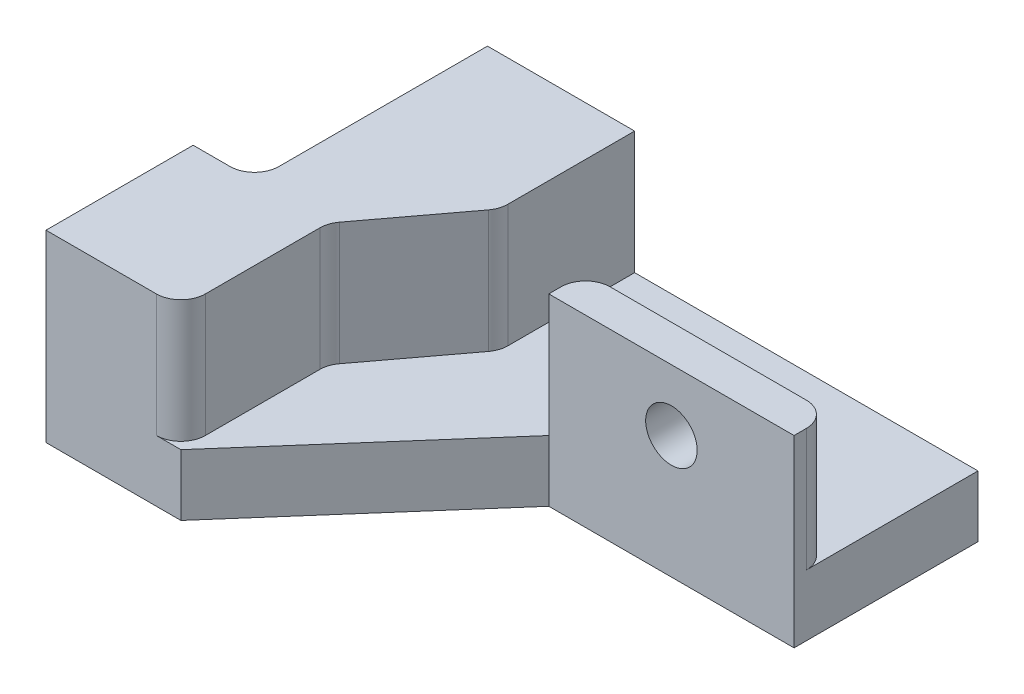
ISO-10303-21;
HEADER;
FILE_DESCRIPTION(('STEP AP214'),'2;1');
FILE_NAME('part.step','',(''),(''),'','','');
FILE_SCHEMA(('AUTOMOTIVE_DESIGN { 1 0 10303 214 1 1 1 1 }'));
ENDSEC;
DATA;
#1=APPLICATION_CONTEXT('core data for automotive mechanical design processes');
#2=APPLICATION_PROTOCOL_DEFINITION('international standard','automotive_design',2000,#1);
#3=PRODUCT_CONTEXT('',#1,'mechanical');
#4=PRODUCT('Part','Part','',(#3));
#5=PRODUCT_RELATED_PRODUCT_CATEGORY('part','',(#4));
#6=PRODUCT_DEFINITION_FORMATION('','',#4);
#7=PRODUCT_DEFINITION_CONTEXT('part definition',#1,'design');
#8=PRODUCT_DEFINITION('design','',#6,#7);
#9=PRODUCT_DEFINITION_SHAPE('','',#8);
#10=(LENGTH_UNIT() NAMED_UNIT(*) SI_UNIT(.MILLI.,.METRE.));
#11=(NAMED_UNIT(*) PLANE_ANGLE_UNIT() SI_UNIT($,.RADIAN.));
#12=(NAMED_UNIT(*) SI_UNIT($,.STERADIAN.) SOLID_ANGLE_UNIT());
#13=UNCERTAINTY_MEASURE_WITH_UNIT(LENGTH_MEASURE(1.E-05),#10,'distance_accuracy_value','');
#14=(GEOMETRIC_REPRESENTATION_CONTEXT(3) GLOBAL_UNCERTAINTY_ASSIGNED_CONTEXT((#13)) GLOBAL_UNIT_ASSIGNED_CONTEXT((#10,
#11,#12)) REPRESENTATION_CONTEXT('',''));
#15=CARTESIAN_POINT('',(0.,0.,0.));
#16=DIRECTION('',(0.,0.,1.));
#17=DIRECTION('',(1.,0.,0.));
#18=AXIS2_PLACEMENT_3D('',#15,#16,#17);
#19=CARTESIAN_POINT('',(0.,5.,0.));
#20=DIRECTION('',(0.,1.,0.));
#21=DIRECTION('',(0.,0.,-1.));
#22=AXIS2_PLACEMENT_3D('',#19,#20,#21);
#23=PLANE('',#22);
#24=DIRECTION('',(0.,0.,1.));
#25=VECTOR('',#24,1.);
#26=CARTESIAN_POINT('',(-20.,5.,0.));
#27=LINE('',#26,#25);
#28=CARTESIAN_POINT('',(-20.,5.,-15.));
#29=VERTEX_POINT('',#28);
#30=CARTESIAN_POINT('',(-20.,5.,1.99999999999999));
#31=VERTEX_POINT('',#30);
#32=EDGE_CURVE('E347',#29,#31,#27,.T.);
#33=ORIENTED_EDGE('',*,*,#32,.F.);
#34=DIRECTION('',(1.,0.,0.));
#35=VECTOR('',#34,1.);
#36=CARTESIAN_POINT('',(-25.,5.,-15.));
#37=LINE('',#36,#35);
#38=CARTESIAN_POINT('',(-25.,5.,-15.));
#39=VERTEX_POINT('',#38);
#40=EDGE_CURVE('E206',#39,#29,#37,.T.);
#41=ORIENTED_EDGE('',*,*,#40,.F.);
#42=DIRECTION('',(0.,0.,-1.));
#43=VECTOR('',#42,1.);
#44=CARTESIAN_POINT('',(-25.,5.,16.));
#45=LINE('',#44,#43);
#46=CARTESIAN_POINT('',(-25.,5.,3.99999999999999));
#47=VERTEX_POINT('',#46);
#48=EDGE_CURVE('E244',#47,#39,#45,.T.);
#49=ORIENTED_EDGE('',*,*,#48,.F.);
#50=DIRECTION('',(-1.,0.,0.));
#51=VECTOR('',#50,1.);
#52=CARTESIAN_POINT('',(0.,5.,4.));
#53=LINE('',#52,#51);
#54=CARTESIAN_POINT('',(-22.,5.,3.99999999999999));
#55=VERTEX_POINT('',#54);
#56=EDGE_CURVE('E351',#55,#47,#53,.T.);
#57=ORIENTED_EDGE('',*,*,#56,.F.);
#58=CARTESIAN_POINT('',(-22.,5.,1.99999999999999));
#59=DIRECTION('',(0.,-1.,0.));
#60=DIRECTION('',(0.,0.,-1.));
#61=AXIS2_PLACEMENT_3D('',#58,#59,#60);
#62=CIRCLE('',#61,2.);
#63=EDGE_CURVE('E296',#31,#55,#62,.T.);
#64=ORIENTED_EDGE('',*,*,#63,.F.);
#65=EDGE_LOOP('',(#33,#41,#49,#57,#64));
#66=FACE_BOUND('',#65,.T.);
#67=ADVANCED_FACE('F37',(#66),#23,.T.);
#68=DIRECTION('',(0.,0.,-1.));
#69=VECTOR('',#68,1.);
#70=CARTESIAN_POINT('',(-14.,5.,0.));
#71=LINE('',#70,#69);
#72=CARTESIAN_POINT('',(-14.,5.,14.));
#73=VERTEX_POINT('',#72);
#74=CARTESIAN_POINT('',(-14.,5.,4.66666666666666));
#75=VERTEX_POINT('',#74);
#76=EDGE_CURVE('E349',#73,#75,#71,.T.);
#77=ORIENTED_EDGE('',*,*,#76,.F.);
#78=CARTESIAN_POINT('',(-16.,5.,14.));
#79=DIRECTION('',(0.,-1.,0.));
#80=DIRECTION('',(0.,0.,-1.));
#81=AXIS2_PLACEMENT_3D('',#78,#79,#80);
#82=CIRCLE('',#81,2.);
#83=CARTESIAN_POINT('',(-16.,5.,16.));
#84=VERTEX_POINT('',#83);
#85=EDGE_CURVE('E332',#84,#73,#82,.F.);
#86=ORIENTED_EDGE('',*,*,#85,.F.);
#87=DIRECTION('',(1.,0.,0.));
#88=VECTOR('',#87,1.);
#89=CARTESIAN_POINT('',(0.,5.,16.));
#90=LINE('',#89,#88);
#91=CARTESIAN_POINT('',(-14.,5.,16.));
#92=VERTEX_POINT('',#91);
#93=EDGE_CURVE('E302',#84,#92,#90,.T.);
#94=ORIENTED_EDGE('',*,*,#93,.T.);
#95=DIRECTION('',(-0.658504607868518,0.,0.752576694706878));
#96=VECTOR('',#95,1.);
#97=CARTESIAN_POINT('',(-14.,5.,16.));
#98=LINE('',#97,#96);
#99=CARTESIAN_POINT('',(0.,5.,0.));
#100=VERTEX_POINT('',#99);
#101=EDGE_CURVE('E241',#100,#92,#98,.T.);
#102=ORIENTED_EDGE('',*,*,#101,.F.);
#103=DIRECTION('',(0.,0.,-1.));
#104=VECTOR('',#103,1.);
#105=CARTESIAN_POINT('',(0.,5.,0.));
#106=LINE('',#105,#104);
#107=CARTESIAN_POINT('',(0.,5.,-1.));
#108=VERTEX_POINT('',#107);
#109=EDGE_CURVE('E208',#100,#108,#106,.T.);
#110=ORIENTED_EDGE('',*,*,#109,.T.);
#111=CARTESIAN_POINT('',(2.,5.,-1.));
#112=DIRECTION('',(0.,-1.,0.));
#113=DIRECTION('',(0.,0.,-1.));
#114=AXIS2_PLACEMENT_3D('',#111,#112,#113);
#115=CIRCLE('',#114,2.);
#116=CARTESIAN_POINT('',(2.,5.,-3.));
#117=VERTEX_POINT('',#116);
#118=EDGE_CURVE('E327',#117,#108,#115,.F.);
#119=ORIENTED_EDGE('',*,*,#118,.F.);
#120=DIRECTION('',(1.,0.,0.));
#121=VECTOR('',#120,1.);
#122=CARTESIAN_POINT('',(0.,5.,-3.));
#123=LINE('',#122,#121);
#124=CARTESIAN_POINT('',(18.,5.,-3.));
#125=VERTEX_POINT('',#124);
#126=EDGE_CURVE('E212',#117,#125,#123,.T.);
#127=ORIENTED_EDGE('',*,*,#126,.T.);
#128=CARTESIAN_POINT('',(18.,5.,-1.));
#129=DIRECTION('',(0.,-1.,0.));
#130=DIRECTION('',(0.,0.,-1.));
#131=AXIS2_PLACEMENT_3D('',#128,#129,#130);
#132=CIRCLE('',#131,2.);
#133=CARTESIAN_POINT('',(20.,5.,-0.999999999999999));
#134=VERTEX_POINT('',#133);
#135=EDGE_CURVE('E324',#134,#125,#132,.F.);
#136=ORIENTED_EDGE('',*,*,#135,.F.);
#137=DIRECTION('',(0.,0.,1.));
#138=VECTOR('',#137,1.);
#139=CARTESIAN_POINT('',(20.,5.,0.));
#140=LINE('',#139,#138);
#141=CARTESIAN_POINT('',(20.,5.,-15.));
#142=VERTEX_POINT('',#141);
#143=EDGE_CURVE('E250',#142,#134,#140,.T.);
#144=ORIENTED_EDGE('',*,*,#143,.F.);
#145=CARTESIAN_POINT('',(-8.,5.,-15.));
#146=VERTEX_POINT('',#145);
#147=EDGE_CURVE('E248',#146,#142,#37,.T.);
#148=ORIENTED_EDGE('',*,*,#147,.F.);
#149=DIRECTION('',(0.,0.,-1.));
#150=VECTOR('',#149,1.);
#151=CARTESIAN_POINT('',(-8.,5.,0.));
#152=LINE('',#151,#150);
#153=CARTESIAN_POINT('',(-8.,5.,-4.66666666666667));
#154=VERTEX_POINT('',#153);
#155=EDGE_CURVE('E340',#154,#146,#152,.T.);
#156=ORIENTED_EDGE('',*,*,#155,.F.);
#157=CARTESIAN_POINT('',(-9.99999999999999,5.,-4.66666666666667));
#158=DIRECTION('',(0.,-1.,0.));
#159=DIRECTION('',(0.,0.,-1.));
#160=AXIS2_PLACEMENT_3D('',#157,#158,#159);
#161=CIRCLE('',#160,2.);
#162=CARTESIAN_POINT('',(-8.4,5.,-3.46666666666667));
#163=VERTEX_POINT('',#162);
#164=EDGE_CURVE('E45',#163,#154,#161,.F.);
#165=ORIENTED_EDGE('',*,*,#164,.F.);
#166=DIRECTION('',(0.6,0.,-0.8));
#167=VECTOR('',#166,1.);
#168=CARTESIAN_POINT('',(-7.04,5.,-5.28));
#169=LINE('',#168,#167);
#170=CARTESIAN_POINT('',(-13.6,5.,3.46666666666666));
#171=VERTEX_POINT('',#170);
#172=EDGE_CURVE('E346',#171,#163,#169,.T.);
#173=ORIENTED_EDGE('',*,*,#172,.F.);
#174=CARTESIAN_POINT('',(-12.,5.,4.66666666666666));
#175=DIRECTION('',(0.,-1.,0.));
#176=DIRECTION('',(0.,0.,-1.));
#177=AXIS2_PLACEMENT_3D('',#174,#175,#176);
#178=CIRCLE('',#177,2.);
#179=EDGE_CURVE('E321',#75,#171,#178,.T.);
#180=ORIENTED_EDGE('',*,*,#179,.F.);
#181=EDGE_LOOP('',(#77,#86,#94,#102,#110,#119,#127,#136,#144,#148,#156,#165,#173,#180));
#182=FACE_BOUND('',#181,.T.);
#183=CARTESIAN_POINT('',(5.,5.,-10.));
#184=DIRECTION('',(0.,-1.,0.));
#185=DIRECTION('',(0.,0.,-1.));
#186=AXIS2_PLACEMENT_3D('',#183,#184,#185);
#187=CIRCLE('',#186,2.1);
#188=CARTESIAN_POINT('',(5.,5.,-12.1));
#189=VERTEX_POINT('',#188);
#190=EDGE_CURVE('E235',#189,#189,#187,.T.);
#191=ORIENTED_EDGE('',*,*,#190,.T.);
#192=EDGE_LOOP('',(#191));
#193=FACE_BOUND('',#192,.T.);
#194=ADVANCED_FACE('F342',(#182,#193),#23,.T.);
#195=CARTESIAN_POINT('',(0.,0.,0.));
#196=DIRECTION('',(0.,1.,0.));
#197=DIRECTION('',(0.,0.,-1.));
#198=AXIS2_PLACEMENT_3D('',#195,#196,#197);
#199=PLANE('',#198);
#200=DIRECTION('',(-0.658504607868518,0.,0.752576694706878));
#201=VECTOR('',#200,1.);
#202=CARTESIAN_POINT('',(-14.,0.,16.));
#203=LINE('',#202,#201);
#204=CARTESIAN_POINT('',(0.,0.,0.));
#205=VERTEX_POINT('',#204);
#206=CARTESIAN_POINT('',(-14.,0.,16.));
#207=VERTEX_POINT('',#206);
#208=EDGE_CURVE('E238',#205,#207,#203,.T.);
#209=ORIENTED_EDGE('',*,*,#208,.T.);
#210=DIRECTION('',(-1.,0.,0.));
#211=VECTOR('',#210,1.);
#212=CARTESIAN_POINT('',(-25.,0.,16.));
#213=LINE('',#212,#211);
#214=CARTESIAN_POINT('',(-25.,0.,16.));
#215=VERTEX_POINT('',#214);
#216=EDGE_CURVE('E256',#207,#215,#213,.T.);
#217=ORIENTED_EDGE('',*,*,#216,.T.);
#218=DIRECTION('',(0.,0.,-1.));
#219=VECTOR('',#218,1.);
#220=CARTESIAN_POINT('',(-25.,0.,16.));
#221=LINE('',#220,#219);
#222=CARTESIAN_POINT('',(-25.,0.,-15.));
#223=VERTEX_POINT('',#222);
#224=EDGE_CURVE('E259',#215,#223,#221,.T.);
#225=ORIENTED_EDGE('',*,*,#224,.T.);
#226=DIRECTION('',(1.,0.,0.));
#227=VECTOR('',#226,1.);
#228=CARTESIAN_POINT('',(20.,0.,-15.));
#229=LINE('',#228,#227);
#230=CARTESIAN_POINT('',(20.,0.,-15.));
#231=VERTEX_POINT('',#230);
#232=EDGE_CURVE('E262',#223,#231,#229,.T.);
#233=ORIENTED_EDGE('',*,*,#232,.T.);
#234=DIRECTION('',(0.,0.,1.));
#235=VECTOR('',#234,1.);
#236=CARTESIAN_POINT('',(20.,0.,0.));
#237=LINE('',#236,#235);
#238=CARTESIAN_POINT('',(20.,0.,0.));
#239=VERTEX_POINT('',#238);
#240=EDGE_CURVE('E265',#231,#239,#237,.T.);
#241=ORIENTED_EDGE('',*,*,#240,.T.);
#242=DIRECTION('',(-1.,0.,0.));
#243=VECTOR('',#242,1.);
#244=CARTESIAN_POINT('',(0.,0.,0.));
#245=LINE('',#244,#243);
#246=EDGE_CURVE('E245',#239,#205,#245,.T.);
#247=ORIENTED_EDGE('',*,*,#246,.T.);
#248=EDGE_LOOP('',(#209,#217,#225,#233,#241,#247));
#249=FACE_BOUND('',#248,.T.);
#250=CARTESIAN_POINT('',(5.,0.,-10.));
#251=DIRECTION('',(0.,-1.,0.));
#252=DIRECTION('',(0.,0.,-1.));
#253=AXIS2_PLACEMENT_3D('',#250,#251,#252);
#254=CIRCLE('',#253,2.1);
#255=CARTESIAN_POINT('',(5.,0.,-12.1));
#256=VERTEX_POINT('',#255);
#257=EDGE_CURVE('E234',#256,#256,#254,.T.);
#258=ORIENTED_EDGE('',*,*,#257,.F.);
#259=EDGE_LOOP('',(#258));
#260=FACE_BOUND('',#259,.T.);
#261=ADVANCED_FACE('F413',(#249,#260),#199,.F.);
#262=CARTESIAN_POINT('',(-14.,5.,16.));
#263=DIRECTION('',(-0.752576694706878,0.,-0.658504607868518));
#264=DIRECTION('',(0.658504607868518,0.,-0.752576694706878));
#265=AXIS2_PLACEMENT_3D('',#262,#263,#264);
#266=PLANE('',#265);
#267=ORIENTED_EDGE('',*,*,#208,.F.);
#268=DIRECTION('',(0.,-1.,0.));
#269=VECTOR('',#268,1.);
#270=CARTESIAN_POINT('',(0.,5.,0.));
#271=LINE('',#270,#269);
#272=EDGE_CURVE('E253',#100,#205,#271,.T.);
#273=ORIENTED_EDGE('',*,*,#272,.F.);
#274=ORIENTED_EDGE('',*,*,#101,.T.);
#275=DIRECTION('',(0.,-1.,0.));
#276=VECTOR('',#275,1.);
#277=CARTESIAN_POINT('',(-14.,5.,16.));
#278=LINE('',#277,#276);
#279=EDGE_CURVE('E279',#92,#207,#278,.T.);
#280=ORIENTED_EDGE('',*,*,#279,.T.);
#281=EDGE_LOOP('',(#267,#273,#274,#280));
#282=FACE_BOUND('',#281,.T.);
#283=ADVANCED_FACE('F420',(#282),#266,.F.);
#284=CARTESIAN_POINT('',(-25.,5.,16.));
#285=DIRECTION('',(0.,0.,-1.));
#286=DIRECTION('',(1.,0.,0.));
#287=AXIS2_PLACEMENT_3D('',#284,#285,#286);
#288=PLANE('',#287);
#289=DIRECTION('',(-1.,0.,0.));
#290=VECTOR('',#289,1.);
#291=CARTESIAN_POINT('',(0.,15.,16.));
#292=LINE('',#291,#290);
#293=CARTESIAN_POINT('',(-16.,15.,16.));
#294=VERTEX_POINT('',#293);
#295=CARTESIAN_POINT('',(-25.,15.,16.));
#296=VERTEX_POINT('',#295);
#297=EDGE_CURVE('E361',#294,#296,#292,.T.);
#298=ORIENTED_EDGE('',*,*,#297,.T.);
#299=DIRECTION('',(0.,-1.,0.));
#300=VECTOR('',#299,1.);
#301=CARTESIAN_POINT('',(-25.,5.,16.));
#302=LINE('',#301,#300);
#303=EDGE_CURVE('E277',#296,#215,#302,.T.);
#304=ORIENTED_EDGE('',*,*,#303,.T.);
#305=ORIENTED_EDGE('',*,*,#216,.F.);
#306=ORIENTED_EDGE('',*,*,#279,.F.);
#307=ORIENTED_EDGE('',*,*,#93,.F.);
#308=DIRECTION('',(0.,-1.,0.));
#309=VECTOR('',#308,1.);
#310=CARTESIAN_POINT('',(-16.,5.,16.));
#311=LINE('',#310,#309);
#312=EDGE_CURVE('E305',#294,#84,#311,.T.);
#313=ORIENTED_EDGE('',*,*,#312,.F.);
#314=EDGE_LOOP('',(#298,#304,#305,#306,#307,#313));
#315=FACE_BOUND('',#314,.T.);
#316=ADVANCED_FACE('F436',(#315),#288,.F.);
#317=CARTESIAN_POINT('',(-25.,5.,16.));
#318=DIRECTION('',(1.,0.,0.));
#319=DIRECTION('',(0.,0.,1.));
#320=AXIS2_PLACEMENT_3D('',#317,#318,#319);
#321=PLANE('',#320);
#322=CARTESIAN_POINT('',(-25.,10.,9.99999999999999));
#323=DIRECTION('',(1.,0.,0.));
#324=DIRECTION('',(0.,0.,-1.));
#325=AXIS2_PLACEMENT_3D('',#322,#323,#324);
#326=CIRCLE('',#325,2.8);
#327=CARTESIAN_POINT('',(-25.,10.,7.19999999999999));
#328=VERTEX_POINT('',#327);
#329=EDGE_CURVE('E754',#328,#328,#326,.T.);
#330=ORIENTED_EDGE('',*,*,#329,.T.);
#331=EDGE_LOOP('',(#330));
#332=FACE_BOUND('',#331,.T.);
#333=ORIENTED_EDGE('',*,*,#224,.F.);
#334=ORIENTED_EDGE('',*,*,#303,.F.);
#335=DIRECTION('',(0.,0.,-1.));
#336=VECTOR('',#335,1.);
#337=CARTESIAN_POINT('',(-25.,15.,0.));
#338=LINE('',#337,#336);
#339=CARTESIAN_POINT('',(-25.,15.,3.99999999999999));
#340=VERTEX_POINT('',#339);
#341=EDGE_CURVE('E356',#296,#340,#338,.T.);
#342=ORIENTED_EDGE('',*,*,#341,.T.);
#343=DIRECTION('',(0.,-1.,0.));
#344=VECTOR('',#343,1.);
#345=CARTESIAN_POINT('',(-25.,15.,3.99999999999999));
#346=LINE('',#345,#344);
#347=EDGE_CURVE('E214',#340,#47,#346,.T.);
#348=ORIENTED_EDGE('',*,*,#347,.T.);
#349=ORIENTED_EDGE('',*,*,#48,.T.);
#350=DIRECTION('',(0.,-1.,0.));
#351=VECTOR('',#350,1.);
#352=CARTESIAN_POINT('',(-25.,5.,-15.));
#353=LINE('',#352,#351);
#354=EDGE_CURVE('E275',#39,#223,#353,.T.);
#355=ORIENTED_EDGE('',*,*,#354,.T.);
#356=EDGE_LOOP('',(#333,#334,#342,#348,#349,#355));
#357=FACE_BOUND('',#356,.T.);
#358=ADVANCED_FACE('F432',(#332,#357),#321,.F.);
#359=CARTESIAN_POINT('',(20.,5.,-15.));
#360=DIRECTION('',(0.,0.,1.));
#361=DIRECTION('',(-1.,0.,0.));
#362=AXIS2_PLACEMENT_3D('',#359,#360,#361);
#363=PLANE('',#362);
#364=CARTESIAN_POINT('',(-14.,10.,-15.));
#365=DIRECTION('',(0.,0.,1.));
#366=DIRECTION('',(1.,0.,0.));
#367=AXIS2_PLACEMENT_3D('',#364,#365,#366);
#368=CIRCLE('',#367,2.8);
#369=CARTESIAN_POINT('',(-11.2,10.,-15.));
#370=VERTEX_POINT('',#369);
#371=EDGE_CURVE('E373',#370,#370,#368,.T.);
#372=ORIENTED_EDGE('',*,*,#371,.T.);
#373=EDGE_LOOP('',(#372));
#374=FACE_BOUND('',#373,.T.);
#375=ORIENTED_EDGE('',*,*,#232,.F.);
#376=ORIENTED_EDGE('',*,*,#354,.F.);
#377=ORIENTED_EDGE('',*,*,#40,.T.);
#378=DIRECTION('',(0.,-1.,0.));
#379=VECTOR('',#378,1.);
#380=CARTESIAN_POINT('',(-20.,15.,-15.));
#381=LINE('',#380,#379);
#382=CARTESIAN_POINT('',(-20.,15.,-15.));
#383=VERTEX_POINT('',#382);
#384=EDGE_CURVE('E189',#383,#29,#381,.T.);
#385=ORIENTED_EDGE('',*,*,#384,.F.);
#386=DIRECTION('',(1.,0.,0.));
#387=VECTOR('',#386,1.);
#388=CARTESIAN_POINT('',(0.,15.,-15.));
#389=LINE('',#388,#387);
#390=CARTESIAN_POINT('',(-8.,15.,-15.));
#391=VERTEX_POINT('',#390);
#392=EDGE_CURVE('E193',#383,#391,#389,.T.);
#393=ORIENTED_EDGE('',*,*,#392,.T.);
#394=DIRECTION('',(0.,-1.,0.));
#395=VECTOR('',#394,1.);
#396=CARTESIAN_POINT('',(-8.,15.,-15.));
#397=LINE('',#396,#395);
#398=EDGE_CURVE('E209',#391,#146,#397,.T.);
#399=ORIENTED_EDGE('',*,*,#398,.T.);
#400=ORIENTED_EDGE('',*,*,#147,.T.);
#401=DIRECTION('',(0.,-1.,0.));
#402=VECTOR('',#401,1.);
#403=CARTESIAN_POINT('',(20.,5.,-15.));
#404=LINE('',#403,#402);
#405=EDGE_CURVE('E273',#142,#231,#404,.T.);
#406=ORIENTED_EDGE('',*,*,#405,.T.);
#407=EDGE_LOOP('',(#375,#376,#377,#385,#393,#399,#400,#406));
#408=FACE_BOUND('',#407,.T.);
#409=ADVANCED_FACE('F204',(#374,#408),#363,.F.);
#410=CARTESIAN_POINT('',(20.,5.,0.));
#411=DIRECTION('',(-1.,0.,0.));
#412=DIRECTION('',(0.,0.,-1.));
#413=AXIS2_PLACEMENT_3D('',#410,#411,#412);
#414=PLANE('',#413);
#415=DIRECTION('',(0.,0.,1.));
#416=VECTOR('',#415,1.);
#417=CARTESIAN_POINT('',(20.,15.,0.));
#418=LINE('',#417,#416);
#419=CARTESIAN_POINT('',(20.,15.,-0.999999999999999));
#420=VERTEX_POINT('',#419);
#421=CARTESIAN_POINT('',(20.,15.,0.));
#422=VERTEX_POINT('',#421);
#423=EDGE_CURVE('E224',#420,#422,#418,.T.);
#424=ORIENTED_EDGE('',*,*,#423,.T.);
#425=DIRECTION('',(0.,-1.,0.));
#426=VECTOR('',#425,1.);
#427=CARTESIAN_POINT('',(20.,5.,0.));
#428=LINE('',#427,#426);
#429=EDGE_CURVE('E271',#422,#239,#428,.T.);
#430=ORIENTED_EDGE('',*,*,#429,.T.);
#431=ORIENTED_EDGE('',*,*,#240,.F.);
#432=ORIENTED_EDGE('',*,*,#405,.F.);
#433=ORIENTED_EDGE('',*,*,#143,.T.);
#434=DIRECTION('',(0.,-1.,0.));
#435=VECTOR('',#434,1.);
#436=CARTESIAN_POINT('',(20.,5.,-0.999999999999999));
#437=LINE('',#436,#435);
#438=EDGE_CURVE('E281',#420,#134,#437,.T.);
#439=ORIENTED_EDGE('',*,*,#438,.F.);
#440=EDGE_LOOP('',(#424,#430,#431,#432,#433,#439));
#441=FACE_BOUND('',#440,.T.);
#442=ADVANCED_FACE('F425',(#441),#414,.F.);
#443=CARTESIAN_POINT('',(0.,5.,0.));
#444=DIRECTION('',(0.,0.,-1.));
#445=DIRECTION('',(1.,0.,0.));
#446=AXIS2_PLACEMENT_3D('',#443,#444,#445);
#447=PLANE('',#446);
#448=CARTESIAN_POINT('',(10.,10.,0.));
#449=DIRECTION('',(0.,0.,1.));
#450=DIRECTION('',(1.,0.,0.));
#451=AXIS2_PLACEMENT_3D('',#448,#449,#450);
#452=CIRCLE('',#451,2.1);
#453=CARTESIAN_POINT('',(12.1,10.,0.));
#454=VERTEX_POINT('',#453);
#455=EDGE_CURVE('E378',#454,#454,#452,.T.);
#456=ORIENTED_EDGE('',*,*,#455,.F.);
#457=EDGE_LOOP('',(#456));
#458=FACE_BOUND('',#457,.T.);
#459=ORIENTED_EDGE('',*,*,#246,.F.);
#460=ORIENTED_EDGE('',*,*,#429,.F.);
#461=DIRECTION('',(-1.,0.,0.));
#462=VECTOR('',#461,1.);
#463=CARTESIAN_POINT('',(0.,15.,0.));
#464=LINE('',#463,#462);
#465=CARTESIAN_POINT('',(0.,15.,0.));
#466=VERTEX_POINT('',#465);
#467=EDGE_CURVE('E227',#422,#466,#464,.T.);
#468=ORIENTED_EDGE('',*,*,#467,.T.);
#469=DIRECTION('',(0.,-1.,0.));
#470=VECTOR('',#469,1.);
#471=CARTESIAN_POINT('',(0.,15.,0.));
#472=LINE('',#471,#470);
#473=EDGE_CURVE('E229',#466,#100,#472,.T.);
#474=ORIENTED_EDGE('',*,*,#473,.T.);
#475=ORIENTED_EDGE('',*,*,#272,.T.);
#476=EDGE_LOOP('',(#459,#460,#468,#474,#475));
#477=FACE_BOUND('',#476,.T.);
#478=ADVANCED_FACE('F422',(#458,#477),#447,.F.);
#479=CARTESIAN_POINT('',(5.,5.,-10.));
#480=DIRECTION('',(0.,-1.,0.));
#481=DIRECTION('',(0.,0.,1.));
#482=AXIS2_PLACEMENT_3D('',#479,#480,#481);
#483=CYLINDRICAL_SURFACE('',#482,2.1);
#484=ORIENTED_EDGE('',*,*,#190,.F.);
#485=EDGE_LOOP('',(#484));
#486=FACE_BOUND('',#485,.T.);
#487=ORIENTED_EDGE('',*,*,#257,.T.);
#488=EDGE_LOOP('',(#487));
#489=FACE_BOUND('',#488,.T.);
#490=ADVANCED_FACE('F416',(#486,#489),#483,.F.);
#491=CARTESIAN_POINT('',(0.,15.,0.));
#492=DIRECTION('',(1.,0.,0.));
#493=DIRECTION('',(0.,0.,1.));
#494=AXIS2_PLACEMENT_3D('',#491,#492,#493);
#495=PLANE('',#494);
#496=ORIENTED_EDGE('',*,*,#109,.F.);
#497=ORIENTED_EDGE('',*,*,#473,.F.);
#498=DIRECTION('',(0.,0.,-1.));
#499=VECTOR('',#498,1.);
#500=CARTESIAN_POINT('',(0.,15.,0.));
#501=LINE('',#500,#499);
#502=CARTESIAN_POINT('',(0.,15.,-1.));
#503=VERTEX_POINT('',#502);
#504=EDGE_CURVE('E218',#466,#503,#501,.T.);
#505=ORIENTED_EDGE('',*,*,#504,.T.);
#506=DIRECTION('',(0.,-1.,0.));
#507=VECTOR('',#506,1.);
#508=CARTESIAN_POINT('',(0.,15.,-1.));
#509=LINE('',#508,#507);
#510=EDGE_CURVE('E292',#108,#503,#509,.F.);
#511=ORIENTED_EDGE('',*,*,#510,.F.);
#512=EDGE_LOOP('',(#496,#497,#505,#511));
#513=FACE_BOUND('',#512,.T.);
#514=ADVANCED_FACE('F616',(#513),#495,.F.);
#515=CARTESIAN_POINT('',(0.,15.,-3.));
#516=DIRECTION('',(0.,0.,1.));
#517=DIRECTION('',(-1.,0.,0.));
#518=AXIS2_PLACEMENT_3D('',#515,#516,#517);
#519=PLANE('',#518);
#520=CARTESIAN_POINT('',(10.,10.,-3.));
#521=DIRECTION('',(0.,0.,1.));
#522=DIRECTION('',(1.,0.,0.));
#523=AXIS2_PLACEMENT_3D('',#520,#521,#522);
#524=CIRCLE('',#523,2.1);
#525=CARTESIAN_POINT('',(12.1,10.,-3.));
#526=VERTEX_POINT('',#525);
#527=EDGE_CURVE('E751',#526,#526,#524,.T.);
#528=ORIENTED_EDGE('',*,*,#527,.T.);
#529=EDGE_LOOP('',(#528));
#530=FACE_BOUND('',#529,.T.);
#531=ORIENTED_EDGE('',*,*,#126,.F.);
#532=DIRECTION('',(0.,-1.,0.));
#533=VECTOR('',#532,1.);
#534=CARTESIAN_POINT('',(2.,15.,-3.));
#535=LINE('',#534,#533);
#536=CARTESIAN_POINT('',(2.,15.,-3.));
#537=VERTEX_POINT('',#536);
#538=EDGE_CURVE('E283',#537,#117,#535,.T.);
#539=ORIENTED_EDGE('',*,*,#538,.F.);
#540=DIRECTION('',(1.,0.,0.));
#541=VECTOR('',#540,1.);
#542=CARTESIAN_POINT('',(0.,15.,-3.));
#543=LINE('',#542,#541);
#544=CARTESIAN_POINT('',(18.,15.,-3.));
#545=VERTEX_POINT('',#544);
#546=EDGE_CURVE('E221',#537,#545,#543,.T.);
#547=ORIENTED_EDGE('',*,*,#546,.T.);
#548=DIRECTION('',(0.,-1.,0.));
#549=VECTOR('',#548,1.);
#550=CARTESIAN_POINT('',(18.,15.,-3.));
#551=LINE('',#550,#549);
#552=EDGE_CURVE('E285',#125,#545,#551,.F.);
#553=ORIENTED_EDGE('',*,*,#552,.F.);
#554=EDGE_LOOP('',(#531,#539,#547,#553));
#555=FACE_BOUND('',#554,.T.);
#556=ADVANCED_FACE('F606',(#530,#555),#519,.F.);
#557=CARTESIAN_POINT('',(0.,15.,0.));
#558=DIRECTION('',(0.,1.,0.));
#559=DIRECTION('',(0.,0.,-1.));
#560=AXIS2_PLACEMENT_3D('',#557,#558,#559);
#561=PLANE('',#560);
#562=ORIENTED_EDGE('',*,*,#546,.F.);
#563=CARTESIAN_POINT('',(2.,15.,-1.));
#564=DIRECTION('',(0.,-1.,0.));
#565=DIRECTION('',(0.,0.,-1.));
#566=AXIS2_PLACEMENT_3D('',#563,#564,#565);
#567=CIRCLE('',#566,2.);
#568=EDGE_CURVE('E288',#503,#537,#567,.T.);
#569=ORIENTED_EDGE('',*,*,#568,.F.);
#570=ORIENTED_EDGE('',*,*,#504,.F.);
#571=ORIENTED_EDGE('',*,*,#467,.F.);
#572=ORIENTED_EDGE('',*,*,#423,.F.);
#573=CARTESIAN_POINT('',(18.,15.,-1.));
#574=DIRECTION('',(0.,-1.,0.));
#575=DIRECTION('',(0.,0.,-1.));
#576=AXIS2_PLACEMENT_3D('',#573,#574,#575);
#577=CIRCLE('',#576,2.);
#578=EDGE_CURVE('E290',#545,#420,#577,.T.);
#579=ORIENTED_EDGE('',*,*,#578,.F.);
#580=EDGE_LOOP('',(#562,#569,#570,#571,#572,#579));
#581=FACE_BOUND('',#580,.T.);
#582=ADVANCED_FACE('F597',(#581),#561,.T.);
#583=CARTESIAN_POINT('',(0.,15.,4.));
#584=DIRECTION('',(0.,0.,-1.));
#585=DIRECTION('',(1.,0.,0.));
#586=AXIS2_PLACEMENT_3D('',#583,#584,#585);
#587=PLANE('',#586);
#588=ORIENTED_EDGE('',*,*,#56,.T.);
#589=ORIENTED_EDGE('',*,*,#347,.F.);
#590=DIRECTION('',(-1.,0.,0.));
#591=VECTOR('',#590,1.);
#592=CARTESIAN_POINT('',(0.,15.,4.));
#593=LINE('',#592,#591);
#594=CARTESIAN_POINT('',(-22.,15.,3.99999999999999));
#595=VERTEX_POINT('',#594);
#596=EDGE_CURVE('E194',#595,#340,#593,.T.);
#597=ORIENTED_EDGE('',*,*,#596,.F.);
#598=DIRECTION('',(0.,-1.,0.));
#599=VECTOR('',#598,1.);
#600=CARTESIAN_POINT('',(-22.,15.,3.99999999999999));
#601=LINE('',#600,#599);
#602=EDGE_CURVE('E299',#55,#595,#601,.F.);
#603=ORIENTED_EDGE('',*,*,#602,.F.);
#604=EDGE_LOOP('',(#588,#589,#597,#603));
#605=FACE_BOUND('',#604,.T.);
#606=ADVANCED_FACE('F586',(#605),#587,.T.);
#607=CARTESIAN_POINT('',(-20.,15.,0.));
#608=DIRECTION('',(-1.,0.,0.));
#609=DIRECTION('',(0.,0.,-1.));
#610=AXIS2_PLACEMENT_3D('',#607,#608,#609);
#611=PLANE('',#610);
#612=DIRECTION('',(0.,0.,1.));
#613=VECTOR('',#612,1.);
#614=CARTESIAN_POINT('',(-20.,15.,0.));
#615=LINE('',#614,#613);
#616=CARTESIAN_POINT('',(-20.,15.,1.99999999999999));
#617=VERTEX_POINT('',#616);
#618=EDGE_CURVE('E184',#383,#617,#615,.T.);
#619=ORIENTED_EDGE('',*,*,#618,.F.);
#620=ORIENTED_EDGE('',*,*,#384,.T.);
#621=ORIENTED_EDGE('',*,*,#32,.T.);
#622=DIRECTION('',(0.,-1.,0.));
#623=VECTOR('',#622,1.);
#624=CARTESIAN_POINT('',(-20.,5.,1.99999999999999));
#625=LINE('',#624,#623);
#626=EDGE_CURVE('E191',#617,#31,#625,.T.);
#627=ORIENTED_EDGE('',*,*,#626,.F.);
#628=EDGE_LOOP('',(#619,#620,#621,#627));
#629=FACE_BOUND('',#628,.T.);
#630=ADVANCED_FACE('F186',(#629),#611,.T.);
#631=CARTESIAN_POINT('',(-8.,15.,0.));
#632=DIRECTION('',(1.,0.,0.));
#633=DIRECTION('',(0.,0.,1.));
#634=AXIS2_PLACEMENT_3D('',#631,#632,#633);
#635=PLANE('',#634);
#636=ORIENTED_EDGE('',*,*,#155,.T.);
#637=ORIENTED_EDGE('',*,*,#398,.F.);
#638=DIRECTION('',(0.,0.,-1.));
#639=VECTOR('',#638,1.);
#640=CARTESIAN_POINT('',(-8.,15.,0.));
#641=LINE('',#640,#639);
#642=CARTESIAN_POINT('',(-8.,15.,-4.66666666666667));
#643=VERTEX_POINT('',#642);
#644=EDGE_CURVE('E199',#643,#391,#641,.T.);
#645=ORIENTED_EDGE('',*,*,#644,.F.);
#646=DIRECTION('',(0.,-1.,0.));
#647=VECTOR('',#646,1.);
#648=CARTESIAN_POINT('',(-8.,15.,-4.66666666666667));
#649=LINE('',#648,#647);
#650=EDGE_CURVE('E52',#154,#643,#649,.F.);
#651=ORIENTED_EDGE('',*,*,#650,.F.);
#652=EDGE_LOOP('',(#636,#637,#645,#651));
#653=FACE_BOUND('',#652,.T.);
#654=ADVANCED_FACE('F399',(#653),#635,.T.);
#655=CARTESIAN_POINT('',(-7.04,15.,-5.28));
#656=DIRECTION('',(0.8,0.,0.6));
#657=DIRECTION('',(-0.6,0.,0.8));
#658=AXIS2_PLACEMENT_3D('',#655,#656,#657);
#659=PLANE('',#658);
#660=DIRECTION('',(0.6,0.,-0.8));
#661=VECTOR('',#660,1.);
#662=CARTESIAN_POINT('',(-7.04,15.,-5.28));
#663=LINE('',#662,#661);
#664=CARTESIAN_POINT('',(-13.6,15.,3.46666666666666));
#665=VERTEX_POINT('',#664);
#666=CARTESIAN_POINT('',(-8.4,15.,-3.46666666666667));
#667=VERTEX_POINT('',#666);
#668=EDGE_CURVE('E385',#665,#667,#663,.T.);
#669=ORIENTED_EDGE('',*,*,#668,.F.);
#670=DIRECTION('',(0.,-1.,0.));
#671=VECTOR('',#670,1.);
#672=CARTESIAN_POINT('',(-13.6,15.,3.46666666666666));
#673=LINE('',#672,#671);
#674=EDGE_CURVE('E316',#171,#665,#673,.F.);
#675=ORIENTED_EDGE('',*,*,#674,.F.);
#676=ORIENTED_EDGE('',*,*,#172,.T.);
#677=DIRECTION('',(0.,-1.,0.));
#678=VECTOR('',#677,1.);
#679=CARTESIAN_POINT('',(-8.4,15.,-3.46666666666667));
#680=LINE('',#679,#678);
#681=EDGE_CURVE('E59',#667,#163,#680,.T.);
#682=ORIENTED_EDGE('',*,*,#681,.F.);
#683=EDGE_LOOP('',(#669,#675,#676,#682));
#684=FACE_BOUND('',#683,.T.);
#685=ADVANCED_FACE('F397',(#684),#659,.T.);
#686=CARTESIAN_POINT('',(-14.,15.,0.));
#687=DIRECTION('',(1.,0.,0.));
#688=DIRECTION('',(0.,0.,1.));
#689=AXIS2_PLACEMENT_3D('',#686,#687,#688);
#690=PLANE('',#689);
#691=ORIENTED_EDGE('',*,*,#76,.T.);
#692=DIRECTION('',(0.,-1.,0.));
#693=VECTOR('',#692,1.);
#694=CARTESIAN_POINT('',(-14.,5.,4.66666666666666));
#695=LINE('',#694,#693);
#696=CARTESIAN_POINT('',(-14.,15.,4.66666666666666));
#697=VERTEX_POINT('',#696);
#698=EDGE_CURVE('E307',#697,#75,#695,.T.);
#699=ORIENTED_EDGE('',*,*,#698,.F.);
#700=DIRECTION('',(0.,0.,-1.));
#701=VECTOR('',#700,1.);
#702=CARTESIAN_POINT('',(-14.,15.,0.));
#703=LINE('',#702,#701);
#704=CARTESIAN_POINT('',(-14.,15.,14.));
#705=VERTEX_POINT('',#704);
#706=EDGE_CURVE('E365',#705,#697,#703,.T.);
#707=ORIENTED_EDGE('',*,*,#706,.F.);
#708=DIRECTION('',(0.,-1.,0.));
#709=VECTOR('',#708,1.);
#710=CARTESIAN_POINT('',(-14.,15.,14.));
#711=LINE('',#710,#709);
#712=EDGE_CURVE('E309',#73,#705,#711,.F.);
#713=ORIENTED_EDGE('',*,*,#712,.F.);
#714=EDGE_LOOP('',(#691,#699,#707,#713));
#715=FACE_BOUND('',#714,.T.);
#716=ADVANCED_FACE('F391',(#715),#690,.T.);
#717=CARTESIAN_POINT('',(0.,15.,0.));
#718=DIRECTION('',(0.,1.,0.));
#719=DIRECTION('',(0.,0.,-1.));
#720=AXIS2_PLACEMENT_3D('',#717,#718,#719);
#721=PLANE('',#720);
#722=ORIENTED_EDGE('',*,*,#706,.T.);
#723=CARTESIAN_POINT('',(-12.,15.,4.66666666666666));
#724=DIRECTION('',(0.,-1.,0.));
#725=DIRECTION('',(0.,0.,-1.));
#726=AXIS2_PLACEMENT_3D('',#723,#724,#725);
#727=CIRCLE('',#726,2.);
#728=EDGE_CURVE('E11',#665,#697,#727,.F.);
#729=ORIENTED_EDGE('',*,*,#728,.F.);
#730=ORIENTED_EDGE('',*,*,#668,.T.);
#731=CARTESIAN_POINT('',(-9.99999999999999,15.,-4.66666666666667));
#732=DIRECTION('',(0.,-1.,0.));
#733=DIRECTION('',(0.,0.,-1.));
#734=AXIS2_PLACEMENT_3D('',#731,#732,#733);
#735=CIRCLE('',#734,2.);
#736=EDGE_CURVE('E312',#643,#667,#735,.T.);
#737=ORIENTED_EDGE('',*,*,#736,.F.);
#738=ORIENTED_EDGE('',*,*,#644,.T.);
#739=ORIENTED_EDGE('',*,*,#392,.F.);
#740=ORIENTED_EDGE('',*,*,#618,.T.);
#741=CARTESIAN_POINT('',(-22.,15.,1.99999999999999));
#742=DIRECTION('',(0.,-1.,0.));
#743=DIRECTION('',(0.,0.,-1.));
#744=AXIS2_PLACEMENT_3D('',#741,#742,#743);
#745=CIRCLE('',#744,2.);
#746=EDGE_CURVE('E330',#595,#617,#745,.F.);
#747=ORIENTED_EDGE('',*,*,#746,.F.);
#748=ORIENTED_EDGE('',*,*,#596,.T.);
#749=ORIENTED_EDGE('',*,*,#341,.F.);
#750=ORIENTED_EDGE('',*,*,#297,.F.);
#751=CARTESIAN_POINT('',(-16.,15.,14.));
#752=DIRECTION('',(0.,-1.,0.));
#753=DIRECTION('',(0.,0.,-1.));
#754=AXIS2_PLACEMENT_3D('',#751,#752,#753);
#755=CIRCLE('',#754,2.);
#756=EDGE_CURVE('E314',#705,#294,#755,.T.);
#757=ORIENTED_EDGE('',*,*,#756,.F.);
#758=EDGE_LOOP('',(#722,#729,#730,#737,#738,#739,#740,#747,#748,#749,#750,#757));
#759=FACE_BOUND('',#758,.T.);
#760=ADVANCED_FACE('F198',(#759),#721,.T.);
#761=CARTESIAN_POINT('',(-14.,10.,-5.9));
#762=DIRECTION('',(0.,0.,-1.));
#763=DIRECTION('',(1.,0.,0.));
#764=AXIS2_PLACEMENT_3D('',#761,#762,#763);
#765=CYLINDRICAL_SURFACE('',#764,2.8);
#766=CARTESIAN_POINT('',(-14.,10.,-5.9));
#767=DIRECTION('',(0.,0.,1.));
#768=DIRECTION('',(1.,0.,0.));
#769=AXIS2_PLACEMENT_3D('',#766,#767,#768);
#770=CIRCLE('',#769,2.8);
#771=CARTESIAN_POINT('',(-11.2,10.,-5.9));
#772=VERTEX_POINT('',#771);
#773=EDGE_CURVE('E368',#772,#772,#770,.T.);
#774=ORIENTED_EDGE('',*,*,#773,.T.);
#775=EDGE_LOOP('',(#774));
#776=FACE_BOUND('',#775,.T.);
#777=ORIENTED_EDGE('',*,*,#371,.F.);
#778=EDGE_LOOP('',(#777));
#779=FACE_BOUND('',#778,.T.);
#780=ADVANCED_FACE('F485',(#776,#779),#765,.F.);
#781=CARTESIAN_POINT('',(-14.,10.,-5.9));
#782=DIRECTION('',(0.,0.,-1.));
#783=DIRECTION('',(1.,0.,0.));
#784=AXIS2_PLACEMENT_3D('',#781,#782,#783);
#785=PLANE('',#784);
#786=ORIENTED_EDGE('',*,*,#773,.F.);
#787=EDGE_LOOP('',(#786));
#788=FACE_BOUND('',#787,.T.);
#789=ADVANCED_FACE('F481',(#788),#785,.T.);
#790=CARTESIAN_POINT('',(10.,10.,6.1));
#791=DIRECTION('',(0.,0.,-1.));
#792=DIRECTION('',(1.,0.,0.));
#793=AXIS2_PLACEMENT_3D('',#790,#791,#792);
#794=CYLINDRICAL_SURFACE('',#793,2.1);
#795=ORIENTED_EDGE('',*,*,#527,.F.);
#796=EDGE_LOOP('',(#795));
#797=FACE_BOUND('',#796,.T.);
#798=ORIENTED_EDGE('',*,*,#455,.T.);
#799=EDGE_LOOP('',(#798));
#800=FACE_BOUND('',#799,.T.);
#801=ADVANCED_FACE('F448',(#797,#800),#794,.F.);
#802=CARTESIAN_POINT('',(18.,5.,-1.));
#803=DIRECTION('',(0.,-1.,0.));
#804=DIRECTION('',(0.,0.,1.));
#805=AXIS2_PLACEMENT_3D('',#802,#803,#804);
#806=CYLINDRICAL_SURFACE('',#805,2.);
#807=ORIENTED_EDGE('',*,*,#578,.T.);
#808=ORIENTED_EDGE('',*,*,#438,.T.);
#809=ORIENTED_EDGE('',*,*,#135,.T.);
#810=ORIENTED_EDGE('',*,*,#552,.T.);
#811=EDGE_LOOP('',(#807,#808,#809,#810));
#812=FACE_BOUND('',#811,.T.);
#813=ADVANCED_FACE('F444',(#812),#806,.T.);
#814=CARTESIAN_POINT('',(2.,15.,-1.));
#815=DIRECTION('',(0.,-1.,0.));
#816=DIRECTION('',(0.,0.,1.));
#817=AXIS2_PLACEMENT_3D('',#814,#815,#816);
#818=CYLINDRICAL_SURFACE('',#817,2.);
#819=ORIENTED_EDGE('',*,*,#568,.T.);
#820=ORIENTED_EDGE('',*,*,#538,.T.);
#821=ORIENTED_EDGE('',*,*,#118,.T.);
#822=ORIENTED_EDGE('',*,*,#510,.T.);
#823=EDGE_LOOP('',(#819,#820,#821,#822));
#824=FACE_BOUND('',#823,.T.);
#825=ADVANCED_FACE('F447',(#824),#818,.T.);
#826=CARTESIAN_POINT('',(-22.,15.,1.99999999999999));
#827=DIRECTION('',(0.,1.,0.));
#828=DIRECTION('',(0.,0.,-1.));
#829=AXIS2_PLACEMENT_3D('',#826,#827,#828);
#830=CYLINDRICAL_SURFACE('',#829,2.);
#831=ORIENTED_EDGE('',*,*,#746,.T.);
#832=ORIENTED_EDGE('',*,*,#626,.T.);
#833=ORIENTED_EDGE('',*,*,#63,.T.);
#834=ORIENTED_EDGE('',*,*,#602,.T.);
#835=EDGE_LOOP('',(#831,#832,#833,#834));
#836=FACE_BOUND('',#835,.T.);
#837=ADVANCED_FACE('F452',(#836),#830,.F.);
#838=CARTESIAN_POINT('',(-16.,5.,14.));
#839=DIRECTION('',(0.,1.,0.));
#840=DIRECTION('',(0.,0.,-1.));
#841=AXIS2_PLACEMENT_3D('',#838,#839,#840);
#842=CYLINDRICAL_SURFACE('',#841,2.);
#843=ORIENTED_EDGE('',*,*,#756,.T.);
#844=ORIENTED_EDGE('',*,*,#312,.T.);
#845=ORIENTED_EDGE('',*,*,#85,.T.);
#846=ORIENTED_EDGE('',*,*,#712,.T.);
#847=EDGE_LOOP('',(#843,#844,#845,#846));
#848=FACE_BOUND('',#847,.T.);
#849=ADVANCED_FACE('F456',(#848),#842,.T.);
#850=CARTESIAN_POINT('',(-9.99999999999999,15.,-4.66666666666667));
#851=DIRECTION('',(0.,-1.,0.));
#852=DIRECTION('',(0.,0.,1.));
#853=AXIS2_PLACEMENT_3D('',#850,#851,#852);
#854=CYLINDRICAL_SURFACE('',#853,2.);
#855=ORIENTED_EDGE('',*,*,#736,.T.);
#856=ORIENTED_EDGE('',*,*,#681,.T.);
#857=ORIENTED_EDGE('',*,*,#164,.T.);
#858=ORIENTED_EDGE('',*,*,#650,.T.);
#859=EDGE_LOOP('',(#855,#856,#857,#858));
#860=FACE_BOUND('',#859,.T.);
#861=ADVANCED_FACE('F336',(#860),#854,.T.);
#862=CARTESIAN_POINT('',(-12.,15.,4.66666666666666));
#863=DIRECTION('',(0.,1.,0.));
#864=DIRECTION('',(0.,0.,-1.));
#865=AXIS2_PLACEMENT_3D('',#862,#863,#864);
#866=CYLINDRICAL_SURFACE('',#865,2.);
#867=ORIENTED_EDGE('',*,*,#728,.T.);
#868=ORIENTED_EDGE('',*,*,#698,.T.);
#869=ORIENTED_EDGE('',*,*,#179,.T.);
#870=ORIENTED_EDGE('',*,*,#674,.T.);
#871=EDGE_LOOP('',(#867,#868,#869,#870));
#872=FACE_BOUND('',#871,.T.);
#873=ADVANCED_FACE('F39',(#872),#866,.F.);
#874=CARTESIAN_POINT('',(-15.9,10.,9.99999999999999));
#875=DIRECTION('',(-1.,0.,0.));
#876=DIRECTION('',(0.,0.,-1.));
#877=AXIS2_PLACEMENT_3D('',#874,#875,#876);
#878=CYLINDRICAL_SURFACE('',#877,2.8);
#879=CARTESIAN_POINT('',(-15.9,10.,9.99999999999999));
#880=DIRECTION('',(1.,0.,0.));
#881=DIRECTION('',(0.,0.,-1.));
#882=AXIS2_PLACEMENT_3D('',#879,#880,#881);
#883=CIRCLE('',#882,2.8);
#884=CARTESIAN_POINT('',(-15.9,10.,7.19999999999999));
#885=VERTEX_POINT('',#884);
#886=EDGE_CURVE('E752',#885,#885,#883,.T.);
#887=ORIENTED_EDGE('',*,*,#886,.T.);
#888=EDGE_LOOP('',(#887));
#889=FACE_BOUND('',#888,.T.);
#890=ORIENTED_EDGE('',*,*,#329,.F.);
#891=EDGE_LOOP('',(#890));
#892=FACE_BOUND('',#891,.T.);
#893=ADVANCED_FACE('F464',(#889,#892),#878,.F.);
#894=CARTESIAN_POINT('',(-15.9,10.,9.99999999999999));
#895=DIRECTION('',(-1.,0.,0.));
#896=DIRECTION('',(0.,0.,-1.));
#897=AXIS2_PLACEMENT_3D('',#894,#895,#896);
#898=PLANE('',#897);
#899=ORIENTED_EDGE('',*,*,#886,.F.);
#900=EDGE_LOOP('',(#899));
#901=FACE_BOUND('',#900,.T.);
#902=ADVANCED_FACE('F468',(#901),#898,.T.);
#903=CLOSED_SHELL('',(#67,#194,#261,#283,#316,#358,#409,#442,#478,#490,#514,#556,#582,#606,#630,
#654,#685,#716,#760,#780,#789,#801,#813,#825,#837,#849,#861,#873,#893,#902));
#904=MANIFOLD_SOLID_BREP('B2',#903);
#905=ADVANCED_BREP_SHAPE_REPRESENTATION('',(#18,#904),#14);
#906=SHAPE_DEFINITION_REPRESENTATION(#9,#905);
ENDSEC;
END-ISO-10303-21;
